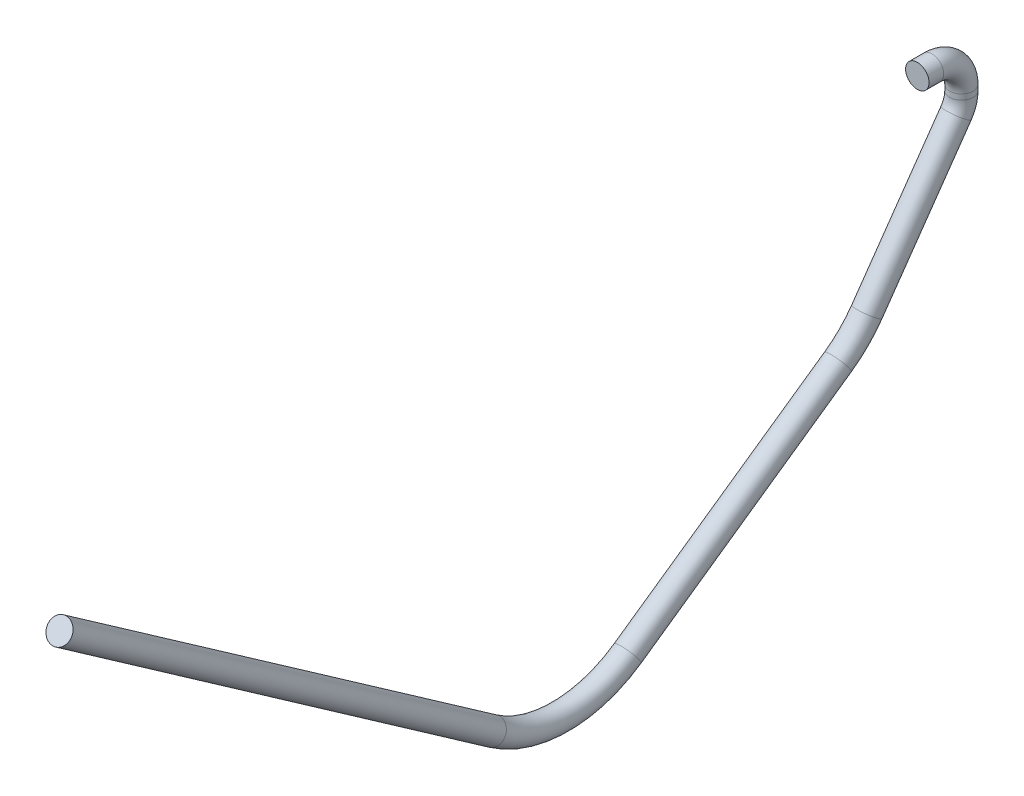
ISO-10303-21;
HEADER;
FILE_DESCRIPTION(('STEP AP214'),'2;1');
FILE_NAME('part.step','',(''),(''),'','','');
FILE_SCHEMA(('AUTOMOTIVE_DESIGN { 1 0 10303 214 1 1 1 1 }'));
ENDSEC;
DATA;
#1=APPLICATION_CONTEXT('core data for automotive mechanical design processes');
#2=APPLICATION_PROTOCOL_DEFINITION('international standard','automotive_design',2000,#1);
#3=PRODUCT_CONTEXT('',#1,'mechanical');
#4=PRODUCT('Part','Part','',(#3));
#5=PRODUCT_RELATED_PRODUCT_CATEGORY('part','',(#4));
#6=PRODUCT_DEFINITION_FORMATION('','',#4);
#7=PRODUCT_DEFINITION_CONTEXT('part definition',#1,'design');
#8=PRODUCT_DEFINITION('design','',#6,#7);
#9=PRODUCT_DEFINITION_SHAPE('','',#8);
#10=(LENGTH_UNIT() NAMED_UNIT(*) SI_UNIT(.MILLI.,.METRE.));
#11=(NAMED_UNIT(*) PLANE_ANGLE_UNIT() SI_UNIT($,.RADIAN.));
#12=(NAMED_UNIT(*) SI_UNIT($,.STERADIAN.) SOLID_ANGLE_UNIT());
#13=UNCERTAINTY_MEASURE_WITH_UNIT(LENGTH_MEASURE(1.E-05),#10,'distance_accuracy_value','');
#14=(GEOMETRIC_REPRESENTATION_CONTEXT(3) GLOBAL_UNCERTAINTY_ASSIGNED_CONTEXT((#13)) GLOBAL_UNIT_ASSIGNED_CONTEXT((#10,
#11,#12)) REPRESENTATION_CONTEXT('',''));
#15=CARTESIAN_POINT('',(0.,0.,0.));
#16=DIRECTION('',(0.,0.,1.));
#17=DIRECTION('',(1.,0.,0.));
#18=AXIS2_PLACEMENT_3D('',#15,#16,#17);
#19=CARTESIAN_POINT('',(0.,0.,0.));
#20=DIRECTION('',(0.,0.,1.));
#21=DIRECTION('',(1.,0.,0.));
#22=AXIS2_PLACEMENT_3D('',#19,#20,#21);
#23=PLANE('',#22);
#24=CARTESIAN_POINT('',(0.,0.,0.));
#25=DIRECTION('',(0.,0.,1.));
#26=DIRECTION('',(1.,0.,0.));
#27=AXIS2_PLACEMENT_3D('',#24,#25,#26);
#28=CIRCLE('',#27,4.);
#29=CARTESIAN_POINT('',(4.,0.,0.));
#30=VERTEX_POINT('',#29);
#31=EDGE_CURVE('E77',#30,#30,#28,.T.);
#32=ORIENTED_EDGE('',*,*,#31,.T.);
#33=EDGE_LOOP('',(#32));
#34=FACE_BOUND('',#33,.T.);
#35=ADVANCED_FACE('F34',(#34),#23,.T.);
#36=CARTESIAN_POINT('',(0.,-17.6177776637566,291.861681912446));
#37=DIRECTION('',(0.,-0.573576436351047,-0.819152044288991));
#38=DIRECTION('',(1.,0.,0.));
#39=AXIS2_PLACEMENT_3D('',#36,#37,#38);
#40=PLANE('',#39);
#41=CARTESIAN_POINT('',(0.,-17.6177776637566,291.861681912446));
#42=DIRECTION('',(0.,-0.573576436351047,-0.819152044288991));
#43=DIRECTION('',(1.,0.,0.));
#44=AXIS2_PLACEMENT_3D('',#41,#42,#43);
#45=CIRCLE('',#44,4.);
#46=CARTESIAN_POINT('',(4.,-17.6177776637566,291.861681912446));
#47=VERTEX_POINT('',#46);
#48=EDGE_CURVE('E10',#47,#47,#45,.T.);
#49=ORIENTED_EDGE('',*,*,#48,.F.);
#50=EDGE_LOOP('',(#49));
#51=FACE_BOUND('',#50,.T.);
#52=ADVANCED_FACE('F86',(#51),#40,.F.);
#53=CARTESIAN_POINT('',(0.,0.,0.));
#54=DIRECTION('',(0.,0.,-1.));
#55=DIRECTION('',(-1.,0.,0.));
#56=AXIS2_PLACEMENT_3D('',#53,#54,#55);
#57=CYLINDRICAL_SURFACE('',#56,4.);
#58=CARTESIAN_POINT('',(0.,0.,-5.));
#59=DIRECTION('',(0.,0.,1.));
#60=DIRECTION('',(1.,0.,0.));
#61=AXIS2_PLACEMENT_3D('',#58,#59,#60);
#62=CIRCLE('',#61,4.);
#63=CARTESIAN_POINT('',(0.,4.,-5.));
#64=VERTEX_POINT('',#63);
#65=EDGE_CURVE('E73',#64,#64,#62,.T.);
#66=ORIENTED_EDGE('',*,*,#65,.T.);
#67=EDGE_LOOP('',(#66));
#68=FACE_BOUND('',#67,.T.);
#69=ORIENTED_EDGE('',*,*,#31,.F.);
#70=EDGE_LOOP('',(#69));
#71=FACE_BOUND('',#70,.T.);
#72=ADVANCED_FACE('F83',(#68,#71),#57,.T.);
#73=CARTESIAN_POINT('',(0.,-10.,-5.));
#74=DIRECTION('',(-1.,0.,0.));
#75=DIRECTION('',(0.,0.,1.));
#76=AXIS2_PLACEMENT_3D('',#73,#74,#75);
#77=TOROIDAL_SURFACE('',#76,10.,4.);
#78=CARTESIAN_POINT('',(0.,-10.,-15.));
#79=DIRECTION('',(0.,1.,0.));
#80=DIRECTION('',(1.,0.,0.));
#81=AXIS2_PLACEMENT_3D('',#78,#79,#80);
#82=CIRCLE('',#81,4.);
#83=CARTESIAN_POINT('',(0.,-10.,-19.));
#84=VERTEX_POINT('',#83);
#85=EDGE_CURVE('E69',#84,#84,#82,.T.);
#86=CARTESIAN_POINT('',(0.,-10.,-5.));
#87=DIRECTION('',(-1.,0.,0.));
#88=DIRECTION('',(0.,0.,1.));
#89=AXIS2_PLACEMENT_3D('',#86,#87,#88);
#90=CIRCLE('',#89,14.);
#91=EDGE_CURVE('',#64,#84,#90,.T.);
#92=ORIENTED_EDGE('',*,*,#65,.F.);
#93=ORIENTED_EDGE('',*,*,#85,.T.);
#94=ORIENTED_EDGE('',*,*,#91,.T.);
#95=ORIENTED_EDGE('',*,*,#91,.F.);
#96=EDGE_LOOP('',(#92,#94,#93,#95));
#97=FACE_BOUND('',#96,.T.);
#98=ADVANCED_FACE('F85',(#97),#77,.T.);
#99=CARTESIAN_POINT('',(0.,-10.,-15.));
#100=DIRECTION('',(0.,-1.,0.));
#101=DIRECTION('',(0.,0.,-1.));
#102=AXIS2_PLACEMENT_3D('',#99,#100,#101);
#103=CYLINDRICAL_SURFACE('',#102,4.);
#104=CARTESIAN_POINT('',(0.,-11.8470121112102,-15.));
#105=DIRECTION('',(0.,1.,0.));
#106=DIRECTION('',(1.,0.,0.));
#107=AXIS2_PLACEMENT_3D('',#104,#105,#106);
#108=CIRCLE('',#107,4.);
#109=CARTESIAN_POINT('',(0.,-11.8470121112101,-19.));
#110=VERTEX_POINT('',#109);
#111=EDGE_CURVE('E65',#110,#110,#108,.T.);
#112=CARTESIAN_POINT('',(0.,-11.8470121112101,-19.));
#113=CARTESIAN_POINT('',(0.,-11.8277724017184,-19.));
#114=CARTESIAN_POINT('',(0.,-11.8085326922266,-19.));
#115=CARTESIAN_POINT('',(0.,-11.7700532732431,-19.));
#116=CARTESIAN_POINT('',(0.,-11.7508135637513,-19.));
#117=CARTESIAN_POINT('',(0.,-11.7123341447677,-19.));
#118=CARTESIAN_POINT('',(0.,-11.693094435276,-19.));
#119=CARTESIAN_POINT('',(0.,-11.6546150162924,-19.));
#120=CARTESIAN_POINT('',(0.,-11.6353753068007,-19.));
#121=CARTESIAN_POINT('',(0.,-11.5968958878171,-19.));
#122=CARTESIAN_POINT('',(0.,-11.5776561783253,-19.));
#123=CARTESIAN_POINT('',(0.,-11.5391767593418,-19.));
#124=CARTESIAN_POINT('',(0.,-11.51993704985,-19.));
#125=CARTESIAN_POINT('',(0.,-11.4814576308665,-19.));
#126=CARTESIAN_POINT('',(0.,-11.4622179213747,-19.));
#127=CARTESIAN_POINT('',(0.,-11.4237385023912,-19.));
#128=CARTESIAN_POINT('',(0.,-11.4044987928994,-19.));
#129=CARTESIAN_POINT('',(0.,-11.3660193739158,-19.));
#130=CARTESIAN_POINT('',(0.,-11.3467796644241,-19.));
#131=CARTESIAN_POINT('',(0.,-11.3083002454405,-19.));
#132=CARTESIAN_POINT('',(0.,-11.2890605359487,-19.));
#133=CARTESIAN_POINT('',(0.,-11.2505811169652,-19.));
#134=CARTESIAN_POINT('',(0.,-11.2313414074734,-19.));
#135=CARTESIAN_POINT('',(0.,-11.1928619884899,-19.));
#136=CARTESIAN_POINT('',(0.,-11.1736222789981,-19.));
#137=CARTESIAN_POINT('',(0.,-11.1351428600146,-19.));
#138=CARTESIAN_POINT('',(0.,-11.1159031505228,-19.));
#139=CARTESIAN_POINT('',(0.,-11.0774237315393,-19.));
#140=CARTESIAN_POINT('',(0.,-11.0581840220475,-19.));
#141=CARTESIAN_POINT('',(0.,-11.0197046030639,-19.));
#142=CARTESIAN_POINT('',(0.,-11.0004648935722,-19.));
#143=CARTESIAN_POINT('',(0.,-10.9619854745886,-19.));
#144=CARTESIAN_POINT('',(0.,-10.9427457650968,-19.));
#145=CARTESIAN_POINT('',(0.,-10.9042663461133,-19.));
#146=CARTESIAN_POINT('',(0.,-10.8850266366215,-19.));
#147=CARTESIAN_POINT('',(0.,-10.846547217638,-19.));
#148=CARTESIAN_POINT('',(0.,-10.8273075081462,-19.));
#149=CARTESIAN_POINT('',(0.,-10.7888280891627,-19.));
#150=CARTESIAN_POINT('',(0.,-10.7695883796709,-19.));
#151=CARTESIAN_POINT('',(0.,-10.7311089606873,-19.));
#152=CARTESIAN_POINT('',(0.,-10.7118692511956,-19.));
#153=CARTESIAN_POINT('',(0.,-10.673389832212,-19.));
#154=CARTESIAN_POINT('',(0.,-10.6541501227203,-19.));
#155=CARTESIAN_POINT('',(0.,-10.6156707037367,-19.));
#156=CARTESIAN_POINT('',(0.,-10.5964309942449,-19.));
#157=CARTESIAN_POINT('',(0.,-10.5579515752614,-19.));
#158=CARTESIAN_POINT('',(0.,-10.5387118657696,-19.));
#159=CARTESIAN_POINT('',(0.,-10.5002324467861,-19.));
#160=CARTESIAN_POINT('',(0.,-10.4809927372943,-19.));
#161=CARTESIAN_POINT('',(0.,-10.4425133183108,-19.));
#162=CARTESIAN_POINT('',(0.,-10.423273608819,-19.));
#163=CARTESIAN_POINT('',(0.,-10.3847941898354,-19.));
#164=CARTESIAN_POINT('',(0.,-10.3655544803437,-19.));
#165=CARTESIAN_POINT('',(0.,-10.3270750613601,-19.));
#166=CARTESIAN_POINT('',(0.,-10.3078353518684,-19.));
#167=CARTESIAN_POINT('',(0.,-10.2693559328848,-19.));
#168=CARTESIAN_POINT('',(0.,-10.250116223393,-19.));
#169=CARTESIAN_POINT('',(0.,-10.2116368044095,-19.));
#170=CARTESIAN_POINT('',(0.,-10.1923970949177,-19.));
#171=CARTESIAN_POINT('',(0.,-10.1539176759342,-19.));
#172=CARTESIAN_POINT('',(0.,-10.1346779664424,-19.));
#173=CARTESIAN_POINT('',(0.,-10.0961985474589,-19.));
#174=CARTESIAN_POINT('',(0.,-10.0769588379671,-19.));
#175=CARTESIAN_POINT('',(0.,-10.0384794189835,-19.));
#176=CARTESIAN_POINT('',(0.,-10.0192397094918,-19.));
#177=CARTESIAN_POINT('',(0.,-10.,-19.));
#178=B_SPLINE_CURVE_WITH_KNOTS('',3,(#112,#113,#114,#115,#116,#117,#118,#119,#120,#121,#122,
#123,#124,#125,#126,#127,#128,#129,#130,#131,#132,#133,#134,#135,#136,#137,#138,#139,#140,#141,
#142,#143,#144,#145,#146,#147,#148,#149,#150,#151,#152,#153,#154,#155,#156,#157,#158,#159,#160,
#161,#162,#163,#164,#165,#166,#167,#168,#169,#170,#171,#172,#173,#174,#175,#176,#177),
.UNSPECIFIED.,.F.,.F.,(4,2,2,2,2,2,2,2,2,2,2,2,2,2,2,2,2,2,2,2,2,2,2,2,2,2,2,2,2,2,2,2,4),(0.,
0.0577191284753184,0.115438256950635,0.173157385425952,0.230876513901268,0.288595642376587,
0.346314770851903,0.40403389932722,0.461753027802539,0.519472156277855,0.577191284753172,
0.63491041322849,0.692629541703807,0.750348670179124,0.80806779865444,0.865786927129759,
0.923506055605075,0.981225184080392,1.03894431255571,1.09666344103103,1.15438256950634,
1.21210169798166,1.26982082645698,1.3275399549323,1.38525908340761,1.44297821188293,
1.50069734035825,1.55841646883356,1.61613559730888,1.6738547257842,1.73157385425952,
1.78929298273483,1.84701211121015),.UNSPECIFIED.);
#179=EDGE_CURVE('BSEAM93',#110,#84,#178,.T.);
#180=ORIENTED_EDGE('',*,*,#111,.T.);
#181=ORIENTED_EDGE('',*,*,#85,.F.);
#182=ORIENTED_EDGE('',*,*,#179,.T.);
#183=ORIENTED_EDGE('',*,*,#179,.F.);
#184=EDGE_LOOP('',(#180,#182,#181,#183));
#185=FACE_BOUND('',#184,.T.);
#186=ADVANCED_FACE('F93',(#185),#103,.T.);
#187=CARTESIAN_POINT('',(0.,-11.8470121112101,-5.));
#188=DIRECTION('',(-1.,0.,0.));
#189=DIRECTION('',(0.,0.,1.));
#190=AXIS2_PLACEMENT_3D('',#187,#188,#189);
#191=TOROIDAL_SURFACE('',#190,10.,4.);
#192=CARTESIAN_POINT('',(0.,-17.5827764747206,-13.1915204428899));
#193=DIRECTION('',(0.,0.81915204428899,-0.573576436351049));
#194=DIRECTION('',(1.,0.,0.));
#195=AXIS2_PLACEMENT_3D('',#192,#193,#194);
#196=CIRCLE('',#195,4.);
#197=CARTESIAN_POINT('',(0.,-19.8770822201248,-16.4681286200459));
#198=VERTEX_POINT('',#197);
#199=EDGE_CURVE('E61',#198,#198,#196,.T.);
#200=CARTESIAN_POINT('',(0.,-11.8470121112101,-5.));
#201=DIRECTION('',(-1.,0.,0.));
#202=DIRECTION('',(0.,0.,1.));
#203=AXIS2_PLACEMENT_3D('',#200,#201,#202);
#204=CIRCLE('',#203,14.);
#205=EDGE_CURVE('',#110,#198,#204,.T.);
#206=ORIENTED_EDGE('',*,*,#111,.F.);
#207=ORIENTED_EDGE('',*,*,#199,.T.);
#208=ORIENTED_EDGE('',*,*,#205,.T.);
#209=ORIENTED_EDGE('',*,*,#205,.F.);
#210=EDGE_LOOP('',(#206,#208,#207,#209));
#211=FACE_BOUND('',#210,.T.);
#212=ADVANCED_FACE('F118',(#211),#191,.T.);
#213=CARTESIAN_POINT('',(0.,-17.5827764747206,-13.1915204428899));
#214=DIRECTION('',(0.,-0.819152044288991,0.573576436351047));
#215=DIRECTION('',(0.,-0.573576436351047,-0.819152044288991));
#216=AXIS2_PLACEMENT_3D('',#213,#214,#215);
#217=CYLINDRICAL_SURFACE('',#216,4.);
#218=CARTESIAN_POINT('',(0.,-60.9543548636342,17.1775856890808));
#219=DIRECTION('',(0.,0.819152044288991,-0.573576436351047));
#220=DIRECTION('',(1.,0.,0.));
#221=AXIS2_PLACEMENT_3D('',#218,#219,#220);
#222=CIRCLE('',#221,4.);
#223=CARTESIAN_POINT('',(0.,-63.2486606090384,13.9009775119249));
#224=VERTEX_POINT('',#223);
#225=EDGE_CURVE('E57',#224,#224,#222,.T.);
#226=ORIENTED_EDGE('',*,*,#225,.T.);
#227=EDGE_LOOP('',(#226));
#228=FACE_BOUND('',#227,.T.);
#229=ORIENTED_EDGE('',*,*,#199,.F.);
#230=EDGE_LOOP('',(#229));
#231=FACE_BOUND('',#230,.T.);
#232=ADVANCED_FACE('F114',(#228,#231),#217,.T.);
#233=CARTESIAN_POINT('',(0.,-38.0112974095924,49.9436674606405));
#234=DIRECTION('',(-1.,0.,0.));
#235=DIRECTION('',(0.,0.,1.));
#236=AXIS2_PLACEMENT_3D('',#233,#234,#235);
#237=TOROIDAL_SURFACE('',#236,40.,4.);
#238=CARTESIAN_POINT('',(0.,-70.7773791811521,27.0006100065986));
#239=DIRECTION('',(0.,0.573576436351046,-0.819152044288992));
#240=DIRECTION('',(1.,0.,0.));
#241=AXIS2_PLACEMENT_3D('',#238,#239,#240);
#242=CIRCLE('',#241,4.);
#243=CARTESIAN_POINT('',(0.,-74.053987358308,24.7063042611945));
#244=VERTEX_POINT('',#243);
#245=EDGE_CURVE('E51',#244,#244,#242,.T.);
#246=CARTESIAN_POINT('',(0.,-38.0112974095924,49.9436674606405));
#247=DIRECTION('',(-1.,0.,0.));
#248=DIRECTION('',(0.,0.,1.));
#249=AXIS2_PLACEMENT_3D('',#246,#247,#248);
#250=CIRCLE('',#249,44.);
#251=EDGE_CURVE('',#224,#244,#250,.T.);
#252=ORIENTED_EDGE('',*,*,#225,.F.);
#253=ORIENTED_EDGE('',*,*,#245,.T.);
#254=ORIENTED_EDGE('',*,*,#251,.T.);
#255=ORIENTED_EDGE('',*,*,#251,.F.);
#256=EDGE_LOOP('',(#252,#254,#253,#255));
#257=FACE_BOUND('',#256,.T.);
#258=ADVANCED_FACE('F110',(#257),#237,.T.);
#259=CARTESIAN_POINT('',(0.,-70.7773791811521,27.0006100065987));
#260=DIRECTION('',(0.,-0.573576436351045,0.819152044288993));
#261=DIRECTION('',(0.,-0.819152044288993,-0.573576436351045));
#262=AXIS2_PLACEMENT_3D('',#259,#260,#261);
#263=CYLINDRICAL_SURFACE('',#262,4.);
#264=CARTESIAN_POINT('',(0.,-120.861536206945,98.5281990323444));
#265=DIRECTION('',(0.,0.573576436351045,-0.819152044288993));
#266=DIRECTION('',(1.,0.,0.));
#267=AXIS2_PLACEMENT_3D('',#264,#265,#266);
#268=CIRCLE('',#267,4.);
#269=CARTESIAN_POINT('',(0.,-124.138144384101,96.2338932869402));
#270=VERTEX_POINT('',#269);
#271=EDGE_CURVE('E46',#270,#270,#268,.T.);
#272=CARTESIAN_POINT('',(0.,-124.138144384101,96.2338932869402));
#273=CARTESIAN_POINT('',(0.,-123.616434415082,95.4888142345887));
#274=CARTESIAN_POINT('',(0.,-123.094724446064,94.7437351822372));
#275=CARTESIAN_POINT('',(0.,-122.051304508026,93.2535770775341));
#276=CARTESIAN_POINT('',(0.,-121.529594539008,92.5084980251826));
#277=CARTESIAN_POINT('',(0.,-120.48617460097,91.0183399204796));
#278=CARTESIAN_POINT('',(0.,-119.964464631952,90.273260868128));
#279=CARTESIAN_POINT('',(0.,-118.921044693914,88.783102763425));
#280=CARTESIAN_POINT('',(0.,-118.399334724896,88.0380237110735));
#281=CARTESIAN_POINT('',(0.,-117.355914786858,86.5478656063705));
#282=CARTESIAN_POINT('',(0.,-116.83420481784,85.802786554019));
#283=CARTESIAN_POINT('',(0.,-115.790784879802,84.3126284493159));
#284=CARTESIAN_POINT('',(0.,-115.269074910784,83.5675493969644));
#285=CARTESIAN_POINT('',(0.,-114.225654972746,82.0773912922614));
#286=CARTESIAN_POINT('',(0.,-113.703945003728,81.3323122399098));
#287=CARTESIAN_POINT('',(0.,-112.66052506569,79.8421541352068));
#288=CARTESIAN_POINT('',(0.,-112.138815096672,79.0970750828553));
#289=CARTESIAN_POINT('',(0.,-111.095395158634,77.6069169781522));
#290=CARTESIAN_POINT('',(0.,-110.573685189616,76.8618379258007));
#291=CARTESIAN_POINT('',(0.,-109.530265251578,75.3716798210977));
#292=CARTESIAN_POINT('',(0.,-109.008555282559,74.6266007687462));
#293=CARTESIAN_POINT('',(0.,-107.965135344522,73.1364426640431));
#294=CARTESIAN_POINT('',(0.,-107.443425375503,72.3913636116916));
#295=CARTESIAN_POINT('',(0.,-106.400005437466,70.9012055069886));
#296=CARTESIAN_POINT('',(0.,-105.878295468447,70.1561264546371));
#297=CARTESIAN_POINT('',(0.,-104.83487553041,68.665968349934));
#298=CARTESIAN_POINT('',(0.,-104.313165561391,67.9208892975825));
#299=CARTESIAN_POINT('',(0.,-103.269745623354,66.4307311928794));
#300=CARTESIAN_POINT('',(0.,-102.748035654335,65.6856521405279));
#301=CARTESIAN_POINT('',(0.,-101.704615716298,64.1954940358249));
#302=CARTESIAN_POINT('',(0.,-101.182905747279,63.4504149834734));
#303=CARTESIAN_POINT('',(0.,-100.139485809242,61.9602568787704));
#304=CARTESIAN_POINT('',(0.,-99.6177758402233,61.2151778264188));
#305=CARTESIAN_POINT('',(0.,-98.5743559021859,59.7250197217158));
#306=CARTESIAN_POINT('',(0.,-98.0526459331672,58.9799406693643));
#307=CARTESIAN_POINT('',(0.,-97.0092259951299,57.4897825646612));
#308=CARTESIAN_POINT('',(0.,-96.4875160261112,56.7447035123097));
#309=CARTESIAN_POINT('',(0.,-95.4440960880738,55.2545454076067));
#310=CARTESIAN_POINT('',(0.,-94.9223861190551,54.5094663552552));
#311=CARTESIAN_POINT('',(0.,-93.8789661810178,53.0193082505521));
#312=CARTESIAN_POINT('',(0.,-93.3572562119991,52.2742291982006));
#313=CARTESIAN_POINT('',(0.,-92.3138362739618,50.7840710934976));
#314=CARTESIAN_POINT('',(0.,-91.7921263049431,50.0389920411461));
#315=CARTESIAN_POINT('',(0.,-90.7487063669057,48.548833936443));
#316=CARTESIAN_POINT('',(0.,-90.2269963978871,47.8037548840915));
#317=CARTESIAN_POINT('',(0.,-89.1835764598497,46.3135967793885));
#318=CARTESIAN_POINT('',(0.,-88.661866490831,45.568517727037));
#319=CARTESIAN_POINT('',(0.,-87.6184465527937,44.0783596223339));
#320=CARTESIAN_POINT('',(0.,-87.096736583775,43.3332805699824));
#321=CARTESIAN_POINT('',(0.,-86.0533166457376,41.8431224652794));
#322=CARTESIAN_POINT('',(0.,-85.531606676719,41.0980434129278));
#323=CARTESIAN_POINT('',(0.,-84.4881867386816,39.6078853082248));
#324=CARTESIAN_POINT('',(0.,-83.9664767696629,38.8628062558733));
#325=CARTESIAN_POINT('',(0.,-82.9230568316256,37.3726481511703));
#326=CARTESIAN_POINT('',(0.,-82.4013468626069,36.6275690988187));
#327=CARTESIAN_POINT('',(0.,-81.3579269245695,35.1374109941157));
#328=CARTESIAN_POINT('',(0.,-80.8362169555509,34.3923319417642));
#329=CARTESIAN_POINT('',(0.,-79.7927970175135,32.9021738370611));
#330=CARTESIAN_POINT('',(0.,-79.2710870484948,32.1570947847096));
#331=CARTESIAN_POINT('',(0.,-78.2276671104574,30.6669366800066));
#332=CARTESIAN_POINT('',(0.,-77.7059571414388,29.9218576276551));
#333=CARTESIAN_POINT('',(0.,-76.6625372034014,28.431699522952));
#334=CARTESIAN_POINT('',(0.,-76.1408272343827,27.6866204706005));
#335=CARTESIAN_POINT('',(0.,-75.0974072963454,26.1964623658975));
#336=CARTESIAN_POINT('',(0.,-74.5756973273267,25.451383313546));
#337=CARTESIAN_POINT('',(0.,-74.053987358308,24.7063042611944));
#338=B_SPLINE_CURVE_WITH_KNOTS('',3,(#272,#273,#274,#275,#276,#277,#278,#279,#280,#281,#282,
#283,#284,#285,#286,#287,#288,#289,#290,#291,#292,#293,#294,#295,#296,#297,#298,#299,#300,#301,
#302,#303,#304,#305,#306,#307,#308,#309,#310,#311,#312,#313,#314,#315,#316,#317,#318,#319,#320,
#321,#322,#323,#324,#325,#326,#327,#328,#329,#330,#331,#332,#333,#334,#335,#336,#337),
.UNSPECIFIED.,.F.,.F.,(4,2,2,2,2,2,2,2,2,2,2,2,2,2,2,2,2,2,2,2,2,2,2,2,2,2,2,2,2,2,2,2,4),(0.,
2.7287207211876,5.45744144237521,8.18616216356282,10.9148828847504,13.643603605938,
16.3723243271256,19.1010450483132,21.8297657695008,24.5584864906884,27.287207211876,
30.0159279330636,32.7446486542512,35.4733693754388,38.2020900966264,40.930810817814,
43.6595315390016,46.3882522601892,49.1169729813768,51.8456937025644,54.574414423752,
57.3031351449396,60.0318558661271,62.7605765873147,65.4892973085023,68.2180180296899,
70.9467387508775,73.6754594720651,76.4041801932527,79.1329009144403,81.8616216356279,
84.5903423568155,87.3190630780031),.UNSPECIFIED.);
#339=EDGE_CURVE('BSEAM104',#270,#244,#338,.T.);
#340=ORIENTED_EDGE('',*,*,#271,.T.);
#341=ORIENTED_EDGE('',*,*,#245,.F.);
#342=ORIENTED_EDGE('',*,*,#339,.T.);
#343=ORIENTED_EDGE('',*,*,#339,.F.);
#344=EDGE_LOOP('',(#340,#342,#341,#343));
#345=FACE_BOUND('',#344,.T.);
#346=ADVANCED_FACE('F104',(#345),#263,.T.);
#347=CARTESIAN_POINT('',(0.,-88.0954544353854,121.471256486386));
#348=DIRECTION('',(-1.,0.,0.));
#349=DIRECTION('',(0.,0.,1.));
#350=AXIS2_PLACEMENT_3D('',#347,#348,#349);
#351=TOROIDAL_SURFACE('',#350,40.,4.);
#352=CARTESIAN_POINT('',(0.,-120.861536206945,144.414313940428));
#353=DIRECTION('',(0.,-0.573576436351047,-0.819152044288991));
#354=DIRECTION('',(1.,0.,0.));
#355=AXIS2_PLACEMENT_3D('',#352,#353,#354);
#356=CIRCLE('',#355,4.);
#357=CARTESIAN_POINT('',(0.,-124.138144384101,146.708619685832));
#358=VERTEX_POINT('',#357);
#359=EDGE_CURVE('E41',#358,#358,#356,.T.);
#360=CARTESIAN_POINT('',(0.,-88.0954544353854,121.471256486386));
#361=DIRECTION('',(-1.,0.,0.));
#362=DIRECTION('',(0.,0.,1.));
#363=AXIS2_PLACEMENT_3D('',#360,#361,#362);
#364=CIRCLE('',#363,44.);
#365=EDGE_CURVE('',#270,#358,#364,.T.);
#366=ORIENTED_EDGE('',*,*,#271,.F.);
#367=ORIENTED_EDGE('',*,*,#359,.T.);
#368=ORIENTED_EDGE('',*,*,#365,.T.);
#369=ORIENTED_EDGE('',*,*,#365,.F.);
#370=EDGE_LOOP('',(#366,#368,#367,#369));
#371=FACE_BOUND('',#370,.T.);
#372=ADVANCED_FACE('F99',(#371),#351,.T.);
#373=CARTESIAN_POINT('',(0.,-120.861536206945,144.414313940428));
#374=DIRECTION('',(0.,0.573576436351047,0.819152044288991));
#375=DIRECTION('',(0.,-0.819152044288991,0.573576436351047));
#376=AXIS2_PLACEMENT_3D('',#373,#374,#375);
#377=CYLINDRICAL_SURFACE('',#376,4.);
#378=ORIENTED_EDGE('',*,*,#48,.T.);
#379=EDGE_LOOP('',(#378));
#380=FACE_BOUND('',#379,.T.);
#381=ORIENTED_EDGE('',*,*,#359,.F.);
#382=EDGE_LOOP('',(#381));
#383=FACE_BOUND('',#382,.T.);
#384=ADVANCED_FACE('F97',(#380,#383),#377,.T.);
#385=CLOSED_SHELL('',(#35,#52,#72,#98,#186,#212,#232,#258,#346,#372,#384));
#386=MANIFOLD_SOLID_BREP('B2',#385);
#387=ADVANCED_BREP_SHAPE_REPRESENTATION('',(#18,#386),#14);
#388=SHAPE_DEFINITION_REPRESENTATION(#9,#387);
ENDSEC;
END-ISO-10303-21;
